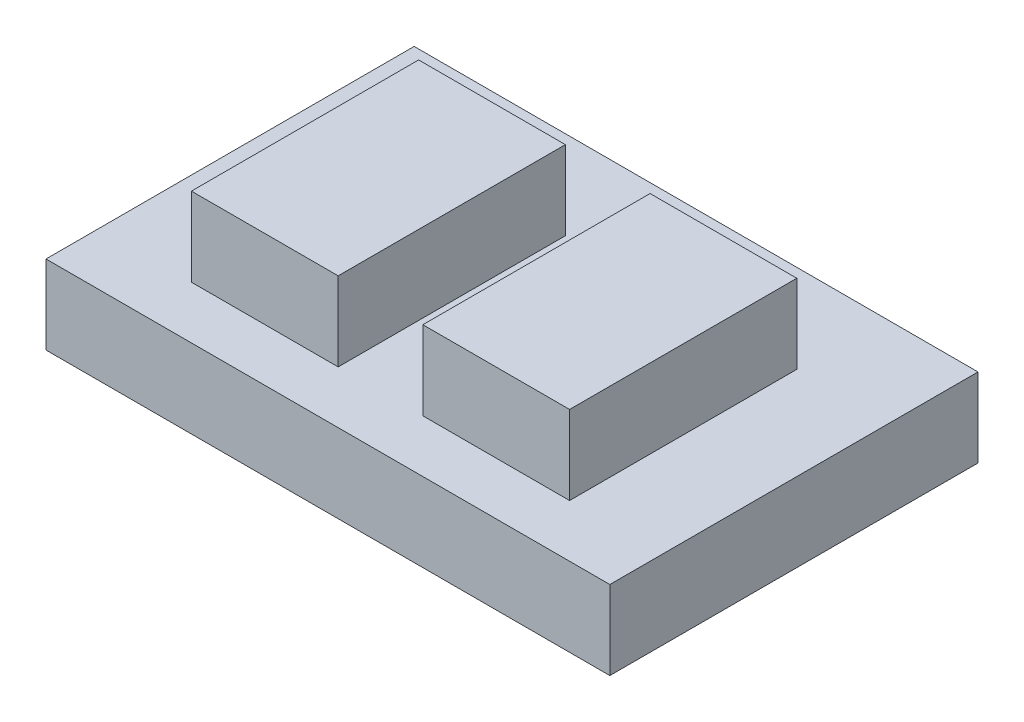
ISO-10303-21;
HEADER;
FILE_DESCRIPTION(('STEP AP214'),'2;1');
FILE_NAME('part.step','',(''),(''),'','','');
FILE_SCHEMA(('AUTOMOTIVE_DESIGN { 1 0 10303 214 1 1 1 1 }'));
ENDSEC;
DATA;
#1=APPLICATION_CONTEXT('core data for automotive mechanical design processes');
#2=APPLICATION_PROTOCOL_DEFINITION('international standard','automotive_design',2000,#1);
#3=PRODUCT_CONTEXT('',#1,'mechanical');
#4=PRODUCT('Part','Part','',(#3));
#5=PRODUCT_RELATED_PRODUCT_CATEGORY('part','',(#4));
#6=PRODUCT_DEFINITION_FORMATION('','',#4);
#7=PRODUCT_DEFINITION_CONTEXT('part definition',#1,'design');
#8=PRODUCT_DEFINITION('design','',#6,#7);
#9=PRODUCT_DEFINITION_SHAPE('','',#8);
#10=(LENGTH_UNIT() NAMED_UNIT(*) SI_UNIT(.MILLI.,.METRE.));
#11=(NAMED_UNIT(*) PLANE_ANGLE_UNIT() SI_UNIT($,.RADIAN.));
#12=(NAMED_UNIT(*) SI_UNIT($,.STERADIAN.) SOLID_ANGLE_UNIT());
#13=UNCERTAINTY_MEASURE_WITH_UNIT(LENGTH_MEASURE(1.E-05),#10,'distance_accuracy_value','');
#14=(GEOMETRIC_REPRESENTATION_CONTEXT(3) GLOBAL_UNCERTAINTY_ASSIGNED_CONTEXT((#13)) GLOBAL_UNIT_ASSIGNED_CONTEXT((#10,
#11,#12)) REPRESENTATION_CONTEXT('',''));
#15=CARTESIAN_POINT('',(0.,0.,0.));
#16=DIRECTION('',(0.,0.,1.));
#17=DIRECTION('',(1.,0.,0.));
#18=AXIS2_PLACEMENT_3D('',#15,#16,#17);
#19=CARTESIAN_POINT('',(0.,1.5,0.));
#20=DIRECTION('',(0.,-1.,0.));
#21=DIRECTION('',(0.,0.,-1.));
#22=AXIS2_PLACEMENT_3D('',#19,#20,#21);
#23=PLANE('',#22);
#24=DIRECTION('',(-1.,0.,0.));
#25=VECTOR('',#24,1.);
#26=CARTESIAN_POINT('',(-3.595,1.5,-1.82));
#27=LINE('',#26,#25);
#28=CARTESIAN_POINT('',(-0.805,1.5,-1.82));
#29=VERTEX_POINT('',#28);
#30=CARTESIAN_POINT('',(-3.595,1.5,-1.82));
#31=VERTEX_POINT('',#30);
#32=EDGE_CURVE('E143',#29,#31,#27,.T.);
#33=ORIENTED_EDGE('',*,*,#32,.F.);
#34=DIRECTION('',(0.,0.,-1.));
#35=VECTOR('',#34,1.);
#36=CARTESIAN_POINT('',(-0.805,1.5,-1.82));
#37=LINE('',#36,#35);
#38=CARTESIAN_POINT('',(-0.805000000000001,1.5,2.5));
#39=VERTEX_POINT('',#38);
#40=EDGE_CURVE('E156',#39,#29,#37,.T.);
#41=ORIENTED_EDGE('',*,*,#40,.F.);
#42=DIRECTION('',(1.,0.,0.));
#43=VECTOR('',#42,1.);
#44=CARTESIAN_POINT('',(-3.595,1.5,2.5));
#45=LINE('',#44,#43);
#46=CARTESIAN_POINT('',(-3.595,1.5,2.5));
#47=VERTEX_POINT('',#46);
#48=EDGE_CURVE('E165',#47,#39,#45,.T.);
#49=ORIENTED_EDGE('',*,*,#48,.F.);
#50=DIRECTION('',(0.,0.,1.));
#51=VECTOR('',#50,1.);
#52=CARTESIAN_POINT('',(-3.595,1.5,-1.82));
#53=LINE('',#52,#51);
#54=EDGE_CURVE('E146',#31,#47,#53,.T.);
#55=ORIENTED_EDGE('',*,*,#54,.F.);
#56=EDGE_LOOP('',(#33,#41,#49,#55));
#57=FACE_BOUND('',#56,.T.);
#58=DIRECTION('',(-1.,0.,0.));
#59=VECTOR('',#58,1.);
#60=CARTESIAN_POINT('',(-5.36,1.5,-3.5));
#61=LINE('',#60,#59);
#62=CARTESIAN_POINT('',(5.36,1.5,-3.5));
#63=VERTEX_POINT('',#62);
#64=CARTESIAN_POINT('',(-5.36,1.5,-3.5));
#65=VERTEX_POINT('',#64);
#66=EDGE_CURVE('E182',#63,#65,#61,.T.);
#67=ORIENTED_EDGE('',*,*,#66,.T.);
#68=DIRECTION('',(0.,0.,1.));
#69=VECTOR('',#68,1.);
#70=CARTESIAN_POINT('',(-5.36,1.5,-3.5));
#71=LINE('',#70,#69);
#72=CARTESIAN_POINT('',(-5.36,1.5,3.5));
#73=VERTEX_POINT('',#72);
#74=EDGE_CURVE('E185',#65,#73,#71,.T.);
#75=ORIENTED_EDGE('',*,*,#74,.T.);
#76=DIRECTION('',(1.,0.,0.));
#77=VECTOR('',#76,1.);
#78=CARTESIAN_POINT('',(-5.36,1.5,3.5));
#79=LINE('',#78,#77);
#80=CARTESIAN_POINT('',(5.36,1.5,3.5));
#81=VERTEX_POINT('',#80);
#82=EDGE_CURVE('E188',#73,#81,#79,.T.);
#83=ORIENTED_EDGE('',*,*,#82,.T.);
#84=DIRECTION('',(0.,0.,-1.));
#85=VECTOR('',#84,1.);
#86=CARTESIAN_POINT('',(5.36,1.5,-3.5));
#87=LINE('',#86,#85);
#88=EDGE_CURVE('E190',#81,#63,#87,.T.);
#89=ORIENTED_EDGE('',*,*,#88,.T.);
#90=EDGE_LOOP('',(#67,#75,#83,#89));
#91=FACE_BOUND('',#90,.T.);
#92=DIRECTION('',(-1.,0.,0.));
#93=VECTOR('',#92,1.);
#94=CARTESIAN_POINT('',(0.805,1.5,-1.82));
#95=LINE('',#94,#93);
#96=CARTESIAN_POINT('',(3.595,1.5,-1.82));
#97=VERTEX_POINT('',#96);
#98=CARTESIAN_POINT('',(0.805,1.5,-1.82));
#99=VERTEX_POINT('',#98);
#100=EDGE_CURVE('E142',#97,#99,#95,.T.);
#101=ORIENTED_EDGE('',*,*,#100,.F.);
#102=DIRECTION('',(0.,0.,-1.));
#103=VECTOR('',#102,1.);
#104=CARTESIAN_POINT('',(3.595,1.5,-1.82));
#105=LINE('',#104,#103);
#106=CARTESIAN_POINT('',(3.595,1.5,2.5));
#107=VERTEX_POINT('',#106);
#108=EDGE_CURVE('E139',#107,#97,#105,.T.);
#109=ORIENTED_EDGE('',*,*,#108,.F.);
#110=DIRECTION('',(1.,0.,0.));
#111=VECTOR('',#110,1.);
#112=CARTESIAN_POINT('',(0.805,1.5,2.5));
#113=LINE('',#112,#111);
#114=CARTESIAN_POINT('',(0.805,1.5,2.5));
#115=VERTEX_POINT('',#114);
#116=EDGE_CURVE('E53',#115,#107,#113,.T.);
#117=ORIENTED_EDGE('',*,*,#116,.F.);
#118=DIRECTION('',(0.,0.,1.));
#119=VECTOR('',#118,1.);
#120=CARTESIAN_POINT('',(0.805,1.5,-1.82));
#121=LINE('',#120,#119);
#122=EDGE_CURVE('E48',#99,#115,#121,.T.);
#123=ORIENTED_EDGE('',*,*,#122,.F.);
#124=EDGE_LOOP('',(#101,#109,#117,#123));
#125=FACE_BOUND('',#124,.T.);
#126=ADVANCED_FACE('F33',(#57,#91,#125),#23,.F.);
#127=CARTESIAN_POINT('',(-5.36,1.5,-3.5));
#128=DIRECTION('',(0.,0.,1.));
#129=DIRECTION('',(1.,0.,0.));
#130=AXIS2_PLACEMENT_3D('',#127,#128,#129);
#131=PLANE('',#130);
#132=DIRECTION('',(-1.,0.,0.));
#133=VECTOR('',#132,1.);
#134=CARTESIAN_POINT('',(-5.36,0.,-3.5));
#135=LINE('',#134,#133);
#136=CARTESIAN_POINT('',(5.36,0.,-3.5));
#137=VERTEX_POINT('',#136);
#138=CARTESIAN_POINT('',(-5.36,0.,-3.5));
#139=VERTEX_POINT('',#138);
#140=EDGE_CURVE('E181',#137,#139,#135,.T.);
#141=ORIENTED_EDGE('',*,*,#140,.T.);
#142=DIRECTION('',(0.,-1.,0.));
#143=VECTOR('',#142,1.);
#144=CARTESIAN_POINT('',(-5.36,1.5,-3.5));
#145=LINE('',#144,#143);
#146=EDGE_CURVE('E11',#65,#139,#145,.T.);
#147=ORIENTED_EDGE('',*,*,#146,.F.);
#148=ORIENTED_EDGE('',*,*,#66,.F.);
#149=DIRECTION('',(0.,-1.,0.));
#150=VECTOR('',#149,1.);
#151=CARTESIAN_POINT('',(5.36,1.5,-3.5));
#152=LINE('',#151,#150);
#153=EDGE_CURVE('E192',#63,#137,#152,.T.);
#154=ORIENTED_EDGE('',*,*,#153,.T.);
#155=EDGE_LOOP('',(#141,#147,#148,#154));
#156=FACE_BOUND('',#155,.T.);
#157=ADVANCED_FACE('F35',(#156),#131,.F.);
#158=CARTESIAN_POINT('',(-5.36,1.5,-3.5));
#159=DIRECTION('',(1.,0.,0.));
#160=DIRECTION('',(0.,0.,-1.));
#161=AXIS2_PLACEMENT_3D('',#158,#159,#160);
#162=PLANE('',#161);
#163=DIRECTION('',(0.,0.,1.));
#164=VECTOR('',#163,1.);
#165=CARTESIAN_POINT('',(-5.36,0.,-3.5));
#166=LINE('',#165,#164);
#167=CARTESIAN_POINT('',(-5.36,0.,3.5));
#168=VERTEX_POINT('',#167);
#169=EDGE_CURVE('E195',#139,#168,#166,.T.);
#170=ORIENTED_EDGE('',*,*,#169,.T.);
#171=DIRECTION('',(0.,-1.,0.));
#172=VECTOR('',#171,1.);
#173=CARTESIAN_POINT('',(-5.36,1.5,3.5));
#174=LINE('',#173,#172);
#175=EDGE_CURVE('E41',#73,#168,#174,.T.);
#176=ORIENTED_EDGE('',*,*,#175,.F.);
#177=ORIENTED_EDGE('',*,*,#74,.F.);
#178=ORIENTED_EDGE('',*,*,#146,.T.);
#179=EDGE_LOOP('',(#170,#176,#177,#178));
#180=FACE_BOUND('',#179,.T.);
#181=ADVANCED_FACE('F224',(#180),#162,.F.);
#182=CARTESIAN_POINT('',(-5.36,1.5,3.5));
#183=DIRECTION('',(0.,0.,-1.));
#184=DIRECTION('',(-1.,0.,0.));
#185=AXIS2_PLACEMENT_3D('',#182,#183,#184);
#186=PLANE('',#185);
#187=DIRECTION('',(1.,0.,0.));
#188=VECTOR('',#187,1.);
#189=CARTESIAN_POINT('',(-5.36,0.,3.5));
#190=LINE('',#189,#188);
#191=CARTESIAN_POINT('',(5.36,0.,3.5));
#192=VERTEX_POINT('',#191);
#193=EDGE_CURVE('E197',#168,#192,#190,.T.);
#194=ORIENTED_EDGE('',*,*,#193,.T.);
#195=DIRECTION('',(0.,-1.,0.));
#196=VECTOR('',#195,1.);
#197=CARTESIAN_POINT('',(5.36,1.5,3.5));
#198=LINE('',#197,#196);
#199=EDGE_CURVE('E202',#81,#192,#198,.T.);
#200=ORIENTED_EDGE('',*,*,#199,.F.);
#201=ORIENTED_EDGE('',*,*,#82,.F.);
#202=ORIENTED_EDGE('',*,*,#175,.T.);
#203=EDGE_LOOP('',(#194,#200,#201,#202));
#204=FACE_BOUND('',#203,.T.);
#205=ADVANCED_FACE('F209',(#204),#186,.F.);
#206=CARTESIAN_POINT('',(5.36,1.5,-3.5));
#207=DIRECTION('',(-1.,0.,0.));
#208=DIRECTION('',(0.,0.,1.));
#209=AXIS2_PLACEMENT_3D('',#206,#207,#208);
#210=PLANE('',#209);
#211=DIRECTION('',(0.,0.,-1.));
#212=VECTOR('',#211,1.);
#213=CARTESIAN_POINT('',(5.36,0.,-3.5));
#214=LINE('',#213,#212);
#215=EDGE_CURVE('E186',#192,#137,#214,.T.);
#216=ORIENTED_EDGE('',*,*,#215,.T.);
#217=ORIENTED_EDGE('',*,*,#153,.F.);
#218=ORIENTED_EDGE('',*,*,#88,.F.);
#219=ORIENTED_EDGE('',*,*,#199,.T.);
#220=EDGE_LOOP('',(#216,#217,#218,#219));
#221=FACE_BOUND('',#220,.T.);
#222=ADVANCED_FACE('F218',(#221),#210,.F.);
#223=CARTESIAN_POINT('',(0.,0.,0.));
#224=DIRECTION('',(0.,-1.,0.));
#225=DIRECTION('',(0.,0.,-1.));
#226=AXIS2_PLACEMENT_3D('',#223,#224,#225);
#227=PLANE('',#226);
#228=ORIENTED_EDGE('',*,*,#140,.F.);
#229=ORIENTED_EDGE('',*,*,#215,.F.);
#230=ORIENTED_EDGE('',*,*,#193,.F.);
#231=ORIENTED_EDGE('',*,*,#169,.F.);
#232=EDGE_LOOP('',(#228,#229,#230,#231));
#233=FACE_BOUND('',#232,.T.);
#234=ADVANCED_FACE('F215',(#233),#227,.T.);
#235=CARTESIAN_POINT('',(-3.595,3.,-1.82));
#236=DIRECTION('',(0.,0.,1.));
#237=DIRECTION('',(1.,0.,0.));
#238=AXIS2_PLACEMENT_3D('',#235,#236,#237);
#239=PLANE('',#238);
#240=ORIENTED_EDGE('',*,*,#32,.T.);
#241=DIRECTION('',(0.,-1.,0.));
#242=VECTOR('',#241,1.);
#243=CARTESIAN_POINT('',(-3.595,3.,-1.82));
#244=LINE('',#243,#242);
#245=CARTESIAN_POINT('',(-3.595,3.,-1.82));
#246=VERTEX_POINT('',#245);
#247=EDGE_CURVE('E178',#246,#31,#244,.T.);
#248=ORIENTED_EDGE('',*,*,#247,.F.);
#249=DIRECTION('',(-1.,0.,0.));
#250=VECTOR('',#249,1.);
#251=CARTESIAN_POINT('',(-3.595,3.,-1.82));
#252=LINE('',#251,#250);
#253=CARTESIAN_POINT('',(-0.805,3.,-1.82));
#254=VERTEX_POINT('',#253);
#255=EDGE_CURVE('E152',#254,#246,#252,.T.);
#256=ORIENTED_EDGE('',*,*,#255,.F.);
#257=DIRECTION('',(0.,-1.,0.));
#258=VECTOR('',#257,1.);
#259=CARTESIAN_POINT('',(-0.805,3.,-1.82));
#260=LINE('',#259,#258);
#261=EDGE_CURVE('E161',#254,#29,#260,.T.);
#262=ORIENTED_EDGE('',*,*,#261,.T.);
#263=EDGE_LOOP('',(#240,#248,#256,#262));
#264=FACE_BOUND('',#263,.T.);
#265=ADVANCED_FACE('F238',(#264),#239,.F.);
#266=CARTESIAN_POINT('',(-3.595,3.,-1.82));
#267=DIRECTION('',(1.,0.,0.));
#268=DIRECTION('',(0.,0.,-1.));
#269=AXIS2_PLACEMENT_3D('',#266,#267,#268);
#270=PLANE('',#269);
#271=ORIENTED_EDGE('',*,*,#54,.T.);
#272=DIRECTION('',(0.,-1.,0.));
#273=VECTOR('',#272,1.);
#274=CARTESIAN_POINT('',(-3.595,3.,2.5));
#275=LINE('',#274,#273);
#276=CARTESIAN_POINT('',(-3.595,3.,2.5));
#277=VERTEX_POINT('',#276);
#278=EDGE_CURVE('E175',#277,#47,#275,.T.);
#279=ORIENTED_EDGE('',*,*,#278,.F.);
#280=DIRECTION('',(0.,0.,1.));
#281=VECTOR('',#280,1.);
#282=CARTESIAN_POINT('',(-3.595,3.,-1.82));
#283=LINE('',#282,#281);
#284=EDGE_CURVE('E155',#246,#277,#283,.T.);
#285=ORIENTED_EDGE('',*,*,#284,.F.);
#286=ORIENTED_EDGE('',*,*,#247,.T.);
#287=EDGE_LOOP('',(#271,#279,#285,#286));
#288=FACE_BOUND('',#287,.T.);
#289=ADVANCED_FACE('F257',(#288),#270,.F.);
#290=CARTESIAN_POINT('',(-3.595,3.,2.5));
#291=DIRECTION('',(0.,0.,-1.));
#292=DIRECTION('',(-1.,0.,0.));
#293=AXIS2_PLACEMENT_3D('',#290,#291,#292);
#294=PLANE('',#293);
#295=ORIENTED_EDGE('',*,*,#48,.T.);
#296=DIRECTION('',(0.,-1.,0.));
#297=VECTOR('',#296,1.);
#298=CARTESIAN_POINT('',(-0.805000000000001,3.,2.5));
#299=LINE('',#298,#297);
#300=CARTESIAN_POINT('',(-0.805000000000001,3.,2.5));
#301=VERTEX_POINT('',#300);
#302=EDGE_CURVE('E172',#301,#39,#299,.T.);
#303=ORIENTED_EDGE('',*,*,#302,.F.);
#304=DIRECTION('',(1.,0.,0.));
#305=VECTOR('',#304,1.);
#306=CARTESIAN_POINT('',(-3.595,3.,2.5));
#307=LINE('',#306,#305);
#308=EDGE_CURVE('E158',#277,#301,#307,.T.);
#309=ORIENTED_EDGE('',*,*,#308,.F.);
#310=ORIENTED_EDGE('',*,*,#278,.T.);
#311=EDGE_LOOP('',(#295,#303,#309,#310));
#312=FACE_BOUND('',#311,.T.);
#313=ADVANCED_FACE('F264',(#312),#294,.F.);
#314=CARTESIAN_POINT('',(-0.805,3.,-1.82));
#315=DIRECTION('',(-1.,0.,0.));
#316=DIRECTION('',(0.,0.,1.));
#317=AXIS2_PLACEMENT_3D('',#314,#315,#316);
#318=PLANE('',#317);
#319=ORIENTED_EDGE('',*,*,#40,.T.);
#320=ORIENTED_EDGE('',*,*,#261,.F.);
#321=DIRECTION('',(0.,0.,-1.));
#322=VECTOR('',#321,1.);
#323=CARTESIAN_POINT('',(-0.805,3.,-1.82));
#324=LINE('',#323,#322);
#325=EDGE_CURVE('E160',#301,#254,#324,.T.);
#326=ORIENTED_EDGE('',*,*,#325,.F.);
#327=ORIENTED_EDGE('',*,*,#302,.T.);
#328=EDGE_LOOP('',(#319,#320,#326,#327));
#329=FACE_BOUND('',#328,.T.);
#330=ADVANCED_FACE('F271',(#329),#318,.F.);
#331=CARTESIAN_POINT('',(0.,3.,0.));
#332=DIRECTION('',(0.,-1.,0.));
#333=DIRECTION('',(0.,0.,-1.));
#334=AXIS2_PLACEMENT_3D('',#331,#332,#333);
#335=PLANE('',#334);
#336=ORIENTED_EDGE('',*,*,#255,.T.);
#337=ORIENTED_EDGE('',*,*,#284,.T.);
#338=ORIENTED_EDGE('',*,*,#308,.T.);
#339=ORIENTED_EDGE('',*,*,#325,.T.);
#340=EDGE_LOOP('',(#336,#337,#338,#339));
#341=FACE_BOUND('',#340,.T.);
#342=ADVANCED_FACE('F279',(#341),#335,.F.);
#343=CARTESIAN_POINT('',(0.805,3.,-1.82));
#344=DIRECTION('',(0.,0.,1.));
#345=DIRECTION('',(1.,0.,0.));
#346=AXIS2_PLACEMENT_3D('',#343,#344,#345);
#347=PLANE('',#346);
#348=ORIENTED_EDGE('',*,*,#100,.T.);
#349=DIRECTION('',(0.,-1.,0.));
#350=VECTOR('',#349,1.);
#351=CARTESIAN_POINT('',(0.805,3.,-1.82));
#352=LINE('',#351,#350);
#353=CARTESIAN_POINT('',(0.805,3.,-1.82));
#354=VERTEX_POINT('',#353);
#355=EDGE_CURVE('E123',#354,#99,#352,.T.);
#356=ORIENTED_EDGE('',*,*,#355,.F.);
#357=DIRECTION('',(-1.,0.,0.));
#358=VECTOR('',#357,1.);
#359=CARTESIAN_POINT('',(0.805,3.,-1.82));
#360=LINE('',#359,#358);
#361=CARTESIAN_POINT('',(3.595,3.,-1.82));
#362=VERTEX_POINT('',#361);
#363=EDGE_CURVE('E130',#362,#354,#360,.T.);
#364=ORIENTED_EDGE('',*,*,#363,.F.);
#365=DIRECTION('',(0.,-1.,0.));
#366=VECTOR('',#365,1.);
#367=CARTESIAN_POINT('',(3.595,3.,-1.82));
#368=LINE('',#367,#366);
#369=EDGE_CURVE('E368',#362,#97,#368,.T.);
#370=ORIENTED_EDGE('',*,*,#369,.T.);
#371=EDGE_LOOP('',(#348,#356,#364,#370));
#372=FACE_BOUND('',#371,.T.);
#373=ADVANCED_FACE('F141',(#372),#347,.F.);
#374=CARTESIAN_POINT('',(0.805,3.,-1.82));
#375=DIRECTION('',(1.,0.,0.));
#376=DIRECTION('',(0.,0.,-1.));
#377=AXIS2_PLACEMENT_3D('',#374,#375,#376);
#378=PLANE('',#377);
#379=ORIENTED_EDGE('',*,*,#122,.T.);
#380=DIRECTION('',(0.,-1.,0.));
#381=VECTOR('',#380,1.);
#382=CARTESIAN_POINT('',(0.805,3.,2.5));
#383=LINE('',#382,#381);
#384=CARTESIAN_POINT('',(0.805,3.,2.5));
#385=VERTEX_POINT('',#384);
#386=EDGE_CURVE('E126',#385,#115,#383,.T.);
#387=ORIENTED_EDGE('',*,*,#386,.F.);
#388=DIRECTION('',(0.,0.,1.));
#389=VECTOR('',#388,1.);
#390=CARTESIAN_POINT('',(0.805,3.,-1.82));
#391=LINE('',#390,#389);
#392=EDGE_CURVE('E119',#354,#385,#391,.T.);
#393=ORIENTED_EDGE('',*,*,#392,.F.);
#394=ORIENTED_EDGE('',*,*,#355,.T.);
#395=EDGE_LOOP('',(#379,#387,#393,#394));
#396=FACE_BOUND('',#395,.T.);
#397=ADVANCED_FACE('F121',(#396),#378,.F.);
#398=CARTESIAN_POINT('',(0.805,3.,2.5));
#399=DIRECTION('',(0.,0.,-1.));
#400=DIRECTION('',(-1.,0.,0.));
#401=AXIS2_PLACEMENT_3D('',#398,#399,#400);
#402=PLANE('',#401);
#403=ORIENTED_EDGE('',*,*,#116,.T.);
#404=DIRECTION('',(0.,-1.,0.));
#405=VECTOR('',#404,1.);
#406=CARTESIAN_POINT('',(3.595,3.,2.5));
#407=LINE('',#406,#405);
#408=CARTESIAN_POINT('',(3.595,3.,2.5));
#409=VERTEX_POINT('',#408);
#410=EDGE_CURVE('E148',#409,#107,#407,.T.);
#411=ORIENTED_EDGE('',*,*,#410,.F.);
#412=DIRECTION('',(1.,0.,0.));
#413=VECTOR('',#412,1.);
#414=CARTESIAN_POINT('',(0.805,3.,2.5));
#415=LINE('',#414,#413);
#416=EDGE_CURVE('E129',#385,#409,#415,.T.);
#417=ORIENTED_EDGE('',*,*,#416,.F.);
#418=ORIENTED_EDGE('',*,*,#386,.T.);
#419=EDGE_LOOP('',(#403,#411,#417,#418));
#420=FACE_BOUND('',#419,.T.);
#421=ADVANCED_FACE('F300',(#420),#402,.F.);
#422=CARTESIAN_POINT('',(3.595,3.,-1.82));
#423=DIRECTION('',(-1.,0.,0.));
#424=DIRECTION('',(0.,0.,1.));
#425=AXIS2_PLACEMENT_3D('',#422,#423,#424);
#426=PLANE('',#425);
#427=ORIENTED_EDGE('',*,*,#108,.T.);
#428=ORIENTED_EDGE('',*,*,#369,.F.);
#429=DIRECTION('',(0.,0.,-1.));
#430=VECTOR('',#429,1.);
#431=CARTESIAN_POINT('',(3.595,3.,-1.82));
#432=LINE('',#431,#430);
#433=EDGE_CURVE('E135',#409,#362,#432,.T.);
#434=ORIENTED_EDGE('',*,*,#433,.F.);
#435=ORIENTED_EDGE('',*,*,#410,.T.);
#436=EDGE_LOOP('',(#427,#428,#434,#435));
#437=FACE_BOUND('',#436,.T.);
#438=ADVANCED_FACE('F307',(#437),#426,.F.);
#439=CARTESIAN_POINT('',(0.,3.,0.));
#440=DIRECTION('',(0.,-1.,0.));
#441=DIRECTION('',(0.,0.,-1.));
#442=AXIS2_PLACEMENT_3D('',#439,#440,#441);
#443=PLANE('',#442);
#444=ORIENTED_EDGE('',*,*,#363,.T.);
#445=ORIENTED_EDGE('',*,*,#392,.T.);
#446=ORIENTED_EDGE('',*,*,#416,.T.);
#447=ORIENTED_EDGE('',*,*,#433,.T.);
#448=EDGE_LOOP('',(#444,#445,#446,#447));
#449=FACE_BOUND('',#448,.T.);
#450=ADVANCED_FACE('F133',(#449),#443,.F.);
#451=CLOSED_SHELL('',(#126,#157,#181,#205,#222,#234,#265,#289,#313,#330,#342,#373,#397,#421,
#438,#450));
#452=MANIFOLD_SOLID_BREP('B2',#451);
#453=ADVANCED_BREP_SHAPE_REPRESENTATION('',(#18,#452),#14);
#454=SHAPE_DEFINITION_REPRESENTATION(#9,#453);
ENDSEC;
END-ISO-10303-21;
